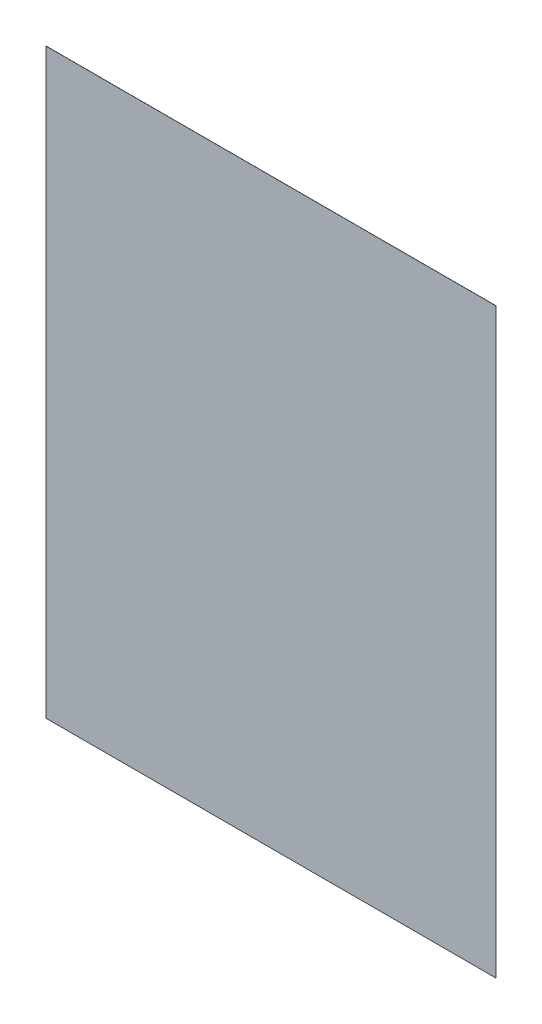
ISO-10303-21;
HEADER;
FILE_DESCRIPTION(('STEP AP214'),'2;1');
FILE_NAME('part.step','',(''),(''),'','','');
FILE_SCHEMA(('AUTOMOTIVE_DESIGN { 1 0 10303 214 1 1 1 1 }'));
ENDSEC;
DATA;
#1=APPLICATION_CONTEXT('core data for automotive mechanical design processes');
#2=APPLICATION_PROTOCOL_DEFINITION('international standard','automotive_design',2000,#1);
#3=PRODUCT_CONTEXT('',#1,'mechanical');
#4=PRODUCT('Part','Part','',(#3));
#5=PRODUCT_RELATED_PRODUCT_CATEGORY('part','',(#4));
#6=PRODUCT_DEFINITION_FORMATION('','',#4);
#7=PRODUCT_DEFINITION_CONTEXT('part definition',#1,'design');
#8=PRODUCT_DEFINITION('design','',#6,#7);
#9=PRODUCT_DEFINITION_SHAPE('','',#8);
#10=(LENGTH_UNIT() NAMED_UNIT(*) SI_UNIT(.MILLI.,.METRE.));
#11=(NAMED_UNIT(*) PLANE_ANGLE_UNIT() SI_UNIT($,.RADIAN.));
#12=(NAMED_UNIT(*) SI_UNIT($,.STERADIAN.) SOLID_ANGLE_UNIT());
#13=UNCERTAINTY_MEASURE_WITH_UNIT(LENGTH_MEASURE(1.E-05),#10,'distance_accuracy_value','');
#14=(GEOMETRIC_REPRESENTATION_CONTEXT(3) GLOBAL_UNCERTAINTY_ASSIGNED_CONTEXT((#13)) GLOBAL_UNIT_ASSIGNED_CONTEXT((#10,
#11,#12)) REPRESENTATION_CONTEXT('',''));
#15=CARTESIAN_POINT('',(0.,0.,0.));
#16=DIRECTION('',(0.,0.,1.));
#17=DIRECTION('',(1.,0.,0.));
#18=AXIS2_PLACEMENT_3D('',#15,#16,#17);
#19=CARTESIAN_POINT('',(-107.95,139.7,0.05));
#20=DIRECTION('',(1.,0.,0.));
#21=DIRECTION('',(0.,1.,0.));
#22=AXIS2_PLACEMENT_3D('',#19,#20,#21);
#23=PLANE('',#22);
#24=DIRECTION('',(0.,-1.,0.));
#25=VECTOR('',#24,1.);
#26=CARTESIAN_POINT('',(-107.95,139.7,0.));
#27=LINE('',#26,#25);
#28=CARTESIAN_POINT('',(-107.95,139.7,0.));
#29=VERTEX_POINT('',#28);
#30=CARTESIAN_POINT('',(-107.95,-139.7,0.));
#31=VERTEX_POINT('',#30);
#32=EDGE_CURVE('E102',#29,#31,#27,.T.);
#33=ORIENTED_EDGE('',*,*,#32,.T.);
#34=DIRECTION('',(0.,0.,-1.));
#35=VECTOR('',#34,1.);
#36=CARTESIAN_POINT('',(-107.95,-139.7,0.05));
#37=LINE('',#36,#35);
#38=CARTESIAN_POINT('',(-107.95,-139.7,0.05));
#39=VERTEX_POINT('',#38);
#40=EDGE_CURVE('E11',#39,#31,#37,.T.);
#41=ORIENTED_EDGE('',*,*,#40,.F.);
#42=DIRECTION('',(0.,-1.,0.));
#43=VECTOR('',#42,1.);
#44=CARTESIAN_POINT('',(-107.95,139.7,0.05));
#45=LINE('',#44,#43);
#46=CARTESIAN_POINT('',(-107.95,139.7,0.05));
#47=VERTEX_POINT('',#46);
#48=EDGE_CURVE('E90',#47,#39,#45,.T.);
#49=ORIENTED_EDGE('',*,*,#48,.F.);
#50=DIRECTION('',(0.,0.,-1.));
#51=VECTOR('',#50,1.);
#52=CARTESIAN_POINT('',(-107.95,139.7,0.05));
#53=LINE('',#52,#51);
#54=EDGE_CURVE('E98',#47,#29,#53,.T.);
#55=ORIENTED_EDGE('',*,*,#54,.T.);
#56=EDGE_LOOP('',(#33,#41,#49,#55));
#57=FACE_BOUND('',#56,.T.);
#58=ADVANCED_FACE('F39',(#57),#23,.F.);
#59=CARTESIAN_POINT('',(-107.95,-139.7,0.05));
#60=DIRECTION('',(0.,1.,0.));
#61=DIRECTION('',(0.,0.,1.));
#62=AXIS2_PLACEMENT_3D('',#59,#60,#61);
#63=PLANE('',#62);
#64=DIRECTION('',(1.,0.,0.));
#65=VECTOR('',#64,1.);
#66=CARTESIAN_POINT('',(-107.95,-139.7,0.));
#67=LINE('',#66,#65);
#68=CARTESIAN_POINT('',(107.95,-139.7,0.));
#69=VERTEX_POINT('',#68);
#70=EDGE_CURVE('E94',#31,#69,#67,.T.);
#71=ORIENTED_EDGE('',*,*,#70,.T.);
#72=DIRECTION('',(0.,0.,-1.));
#73=VECTOR('',#72,1.);
#74=CARTESIAN_POINT('',(107.95,-139.7,0.05));
#75=LINE('',#74,#73);
#76=CARTESIAN_POINT('',(107.95,-139.7,0.05));
#77=VERTEX_POINT('',#76);
#78=EDGE_CURVE('E47',#77,#69,#75,.T.);
#79=ORIENTED_EDGE('',*,*,#78,.F.);
#80=DIRECTION('',(1.,0.,0.));
#81=VECTOR('',#80,1.);
#82=CARTESIAN_POINT('',(-107.95,-139.7,0.05));
#83=LINE('',#82,#81);
#84=EDGE_CURVE('E85',#39,#77,#83,.T.);
#85=ORIENTED_EDGE('',*,*,#84,.F.);
#86=ORIENTED_EDGE('',*,*,#40,.T.);
#87=EDGE_LOOP('',(#71,#79,#85,#86));
#88=FACE_BOUND('',#87,.T.);
#89=ADVANCED_FACE('F93',(#88),#63,.F.);
#90=CARTESIAN_POINT('',(107.95,139.7,0.05));
#91=DIRECTION('',(-1.,0.,0.));
#92=DIRECTION('',(0.,-1.,0.));
#93=AXIS2_PLACEMENT_3D('',#90,#91,#92);
#94=PLANE('',#93);
#95=DIRECTION('',(0.,1.,0.));
#96=VECTOR('',#95,1.);
#97=CARTESIAN_POINT('',(107.95,139.7,0.));
#98=LINE('',#97,#96);
#99=CARTESIAN_POINT('',(107.95,139.7,0.));
#100=VERTEX_POINT('',#99);
#101=EDGE_CURVE('E72',#69,#100,#98,.T.);
#102=ORIENTED_EDGE('',*,*,#101,.T.);
#103=DIRECTION('',(0.,0.,-1.));
#104=VECTOR('',#103,1.);
#105=CARTESIAN_POINT('',(107.95,139.7,0.05));
#106=LINE('',#105,#104);
#107=CARTESIAN_POINT('',(107.95,139.7,0.05));
#108=VERTEX_POINT('',#107);
#109=EDGE_CURVE('E95',#108,#100,#106,.T.);
#110=ORIENTED_EDGE('',*,*,#109,.F.);
#111=DIRECTION('',(0.,1.,0.));
#112=VECTOR('',#111,1.);
#113=CARTESIAN_POINT('',(107.95,139.7,0.05));
#114=LINE('',#113,#112);
#115=EDGE_CURVE('E88',#77,#108,#114,.T.);
#116=ORIENTED_EDGE('',*,*,#115,.F.);
#117=ORIENTED_EDGE('',*,*,#78,.T.);
#118=EDGE_LOOP('',(#102,#110,#116,#117));
#119=FACE_BOUND('',#118,.T.);
#120=ADVANCED_FACE('F96',(#119),#94,.F.);
#121=CARTESIAN_POINT('',(-107.95,139.7,0.05));
#122=DIRECTION('',(0.,-1.,0.));
#123=DIRECTION('',(0.,0.,-1.));
#124=AXIS2_PLACEMENT_3D('',#121,#122,#123);
#125=PLANE('',#124);
#126=DIRECTION('',(-1.,0.,0.));
#127=VECTOR('',#126,1.);
#128=CARTESIAN_POINT('',(-107.95,139.7,0.));
#129=LINE('',#128,#127);
#130=EDGE_CURVE('E78',#100,#29,#129,.T.);
#131=ORIENTED_EDGE('',*,*,#130,.T.);
#132=ORIENTED_EDGE('',*,*,#54,.F.);
#133=DIRECTION('',(-1.,0.,0.));
#134=VECTOR('',#133,1.);
#135=CARTESIAN_POINT('',(-107.95,139.7,0.05));
#136=LINE('',#135,#134);
#137=EDGE_CURVE('E55',#108,#47,#136,.T.);
#138=ORIENTED_EDGE('',*,*,#137,.F.);
#139=ORIENTED_EDGE('',*,*,#109,.T.);
#140=EDGE_LOOP('',(#131,#132,#138,#139));
#141=FACE_BOUND('',#140,.T.);
#142=ADVANCED_FACE('F109',(#141),#125,.F.);
#143=CARTESIAN_POINT('',(0.,0.,0.05));
#144=DIRECTION('',(0.,0.,1.));
#145=DIRECTION('',(1.,0.,0.));
#146=AXIS2_PLACEMENT_3D('',#143,#144,#145);
#147=PLANE('',#146);
#148=ORIENTED_EDGE('',*,*,#48,.T.);
#149=ORIENTED_EDGE('',*,*,#84,.T.);
#150=ORIENTED_EDGE('',*,*,#115,.T.);
#151=ORIENTED_EDGE('',*,*,#137,.T.);
#152=EDGE_LOOP('',(#148,#149,#150,#151));
#153=FACE_BOUND('',#152,.T.);
#154=ADVANCED_FACE('F86',(#153),#147,.T.);
#155=CARTESIAN_POINT('',(0.,0.,0.));
#156=DIRECTION('',(0.,0.,1.));
#157=DIRECTION('',(1.,0.,0.));
#158=AXIS2_PLACEMENT_3D('',#155,#156,#157);
#159=PLANE('',#158);
#160=ORIENTED_EDGE('',*,*,#32,.F.);
#161=ORIENTED_EDGE('',*,*,#130,.F.);
#162=ORIENTED_EDGE('',*,*,#101,.F.);
#163=ORIENTED_EDGE('',*,*,#70,.F.);
#164=EDGE_LOOP('',(#160,#161,#162,#163));
#165=FACE_BOUND('',#164,.T.);
#166=ADVANCED_FACE('F112',(#165),#159,.F.);
#167=CLOSED_SHELL('',(#58,#89,#120,#142,#154,#166));
#168=MANIFOLD_SOLID_BREP('B2',#167);
#169=ADVANCED_BREP_SHAPE_REPRESENTATION('',(#18,#168),#14);
#170=SHAPE_DEFINITION_REPRESENTATION(#9,#169);
ENDSEC;
END-ISO-10303-21;
